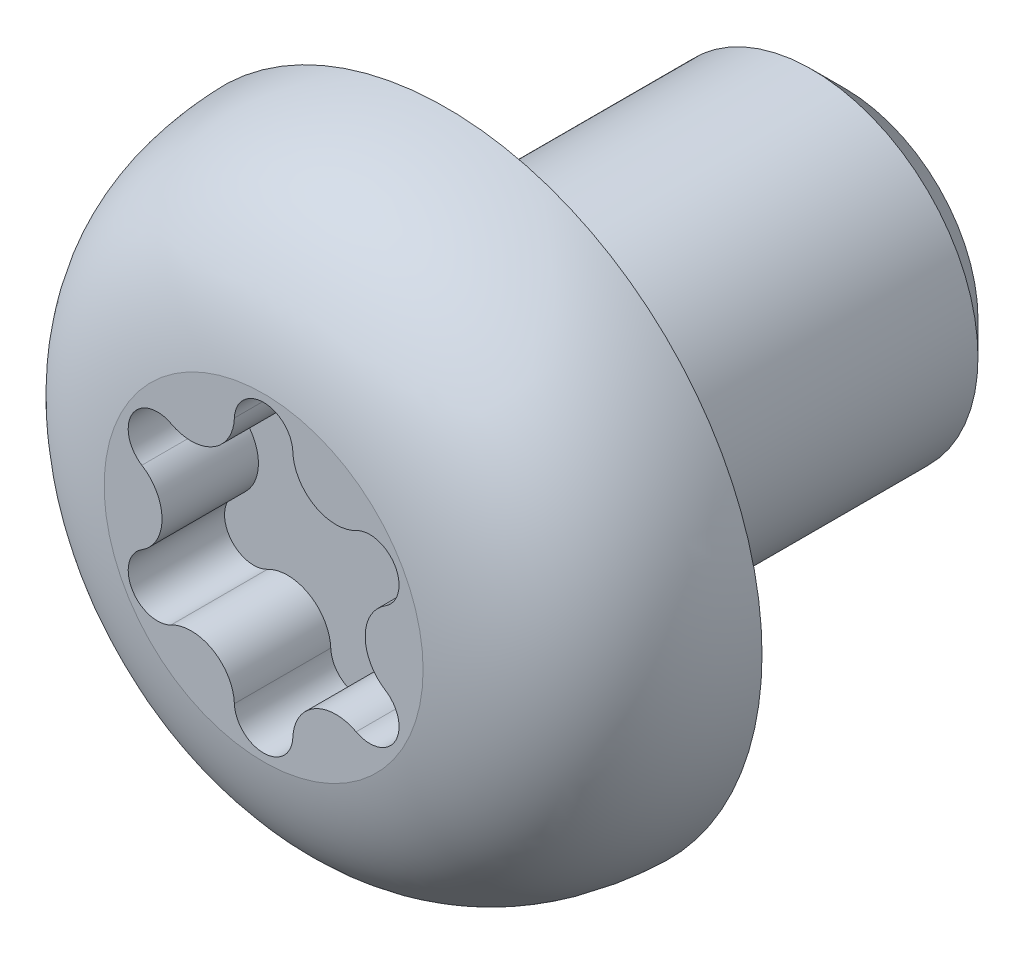
ISO-10303-21;
HEADER;
FILE_DESCRIPTION(('STEP AP214'),'2;1');
FILE_NAME('part.step','',(''),(''),'','','');
FILE_SCHEMA(('AUTOMOTIVE_DESIGN { 1 0 10303 214 1 1 1 1 }'));
ENDSEC;
DATA;
#1=APPLICATION_CONTEXT('core data for automotive mechanical design processes');
#2=APPLICATION_PROTOCOL_DEFINITION('international standard','automotive_design',2000,#1);
#3=PRODUCT_CONTEXT('',#1,'mechanical');
#4=PRODUCT('Part','Part','',(#3));
#5=PRODUCT_RELATED_PRODUCT_CATEGORY('part','',(#4));
#6=PRODUCT_DEFINITION_FORMATION('','',#4);
#7=PRODUCT_DEFINITION_CONTEXT('part definition',#1,'design');
#8=PRODUCT_DEFINITION('design','',#6,#7);
#9=PRODUCT_DEFINITION_SHAPE('','',#8);
#10=(LENGTH_UNIT() NAMED_UNIT(*) SI_UNIT(.MILLI.,.METRE.));
#11=(NAMED_UNIT(*) PLANE_ANGLE_UNIT() SI_UNIT($,.RADIAN.));
#12=(NAMED_UNIT(*) SI_UNIT($,.STERADIAN.) SOLID_ANGLE_UNIT());
#13=UNCERTAINTY_MEASURE_WITH_UNIT(LENGTH_MEASURE(1.E-05),#10,'distance_accuracy_value','');
#14=(GEOMETRIC_REPRESENTATION_CONTEXT(3) GLOBAL_UNCERTAINTY_ASSIGNED_CONTEXT((#13)) GLOBAL_UNIT_ASSIGNED_CONTEXT((#10,
#11,#12)) REPRESENTATION_CONTEXT('',''));
#15=CARTESIAN_POINT('',(0.,0.,0.));
#16=DIRECTION('',(0.,0.,1.));
#17=DIRECTION('',(1.,0.,0.));
#18=AXIS2_PLACEMENT_3D('',#15,#16,#17);
#19=CARTESIAN_POINT('',(0.,0.,1.3));
#20=DIRECTION('',(0.,0.,1.));
#21=DIRECTION('',(1.,0.,0.));
#22=AXIS2_PLACEMENT_3D('',#19,#20,#21);
#23=PLANE('',#22);
#24=CARTESIAN_POINT('',(-1.089207311152,-1.88656240289,1.3));
#25=DIRECTION('',(0.,0.,-1.));
#26=DIRECTION('',(1.,0.,0.));
#27=AXIS2_PLACEMENT_3D('',#24,#25,#26);
#28=CIRCLE('',#27,0.65);
#29=CARTESIAN_POINT('',(-1.392506589353,-1.311662804836,1.3));
#30=VERTEX_POINT('',#29);
#31=CARTESIAN_POINT('',(-0.439680015511,-1.861777483735,1.3));
#32=VERTEX_POINT('',#31);
#33=EDGE_CURVE('E9',#30,#32,#28,.T.);
#34=ORIENTED_EDGE('',*,*,#33,.T.);
#35=CARTESIAN_POINT('',(0.,-1.845,1.3));
#36=DIRECTION('',(0.,0.,1.));
#37=DIRECTION('',(1.,0.,0.));
#38=AXIS2_PLACEMENT_3D('',#35,#36,#37);
#39=CIRCLE('',#38,0.44);
#40=CARTESIAN_POINT('',(0.439680015511,-1.861777483735,1.3));
#41=VERTEX_POINT('',#40);
#42=EDGE_CURVE('E249',#32,#41,#39,.T.);
#43=ORIENTED_EDGE('',*,*,#42,.T.);
#44=CARTESIAN_POINT('',(1.089207311152,-1.88656240289,1.3));
#45=DIRECTION('',(0.,0.,-1.));
#46=DIRECTION('',(1.,0.,0.));
#47=AXIS2_PLACEMENT_3D('',#44,#45,#46);
#48=CIRCLE('',#47,0.65);
#49=CARTESIAN_POINT('',(1.392506589353,-1.311662804836,1.3));
#50=VERTEX_POINT('',#49);
#51=EDGE_CURVE('E278',#41,#50,#48,.T.);
#52=ORIENTED_EDGE('',*,*,#51,.T.);
#53=CARTESIAN_POINT('',(1.597816869982,-0.9225,1.3));
#54=DIRECTION('',(0.,0.,1.));
#55=DIRECTION('',(1.,0.,0.));
#56=AXIS2_PLACEMENT_3D('',#53,#54,#55);
#57=CIRCLE('',#56,0.44);
#58=CARTESIAN_POINT('',(1.832186604864,-0.550114678899,1.3));
#59=VERTEX_POINT('',#58);
#60=EDGE_CURVE('E279',#50,#59,#57,.T.);
#61=ORIENTED_EDGE('',*,*,#60,.T.);
#62=CARTESIAN_POINT('',(2.178414622303,0.,1.3));
#63=DIRECTION('',(0.,0.,-1.));
#64=DIRECTION('',(1.,0.,0.));
#65=AXIS2_PLACEMENT_3D('',#62,#63,#64);
#66=CIRCLE('',#65,0.65);
#67=CARTESIAN_POINT('',(1.832186604864,0.550114678899,1.3));
#68=VERTEX_POINT('',#67);
#69=EDGE_CURVE('E129',#59,#68,#66,.T.);
#70=ORIENTED_EDGE('',*,*,#69,.T.);
#71=CARTESIAN_POINT('',(1.597816869982,0.9225,1.3));
#72=DIRECTION('',(0.,0.,1.));
#73=DIRECTION('',(1.,0.,0.));
#74=AXIS2_PLACEMENT_3D('',#71,#72,#73);
#75=CIRCLE('',#74,0.44);
#76=CARTESIAN_POINT('',(1.392506589353,1.311662804836,1.3));
#77=VERTEX_POINT('',#76);
#78=EDGE_CURVE('E137',#68,#77,#75,.T.);
#79=ORIENTED_EDGE('',*,*,#78,.T.);
#80=CARTESIAN_POINT('',(1.089207311152,1.88656240289,1.3));
#81=DIRECTION('',(0.,0.,-1.));
#82=DIRECTION('',(1.,0.,0.));
#83=AXIS2_PLACEMENT_3D('',#80,#81,#82);
#84=CIRCLE('',#83,0.65);
#85=CARTESIAN_POINT('',(0.439680015511,1.861777483735,1.3));
#86=VERTEX_POINT('',#85);
#87=EDGE_CURVE('E248',#77,#86,#84,.T.);
#88=ORIENTED_EDGE('',*,*,#87,.T.);
#89=CARTESIAN_POINT('',(0.,1.845,1.3));
#90=DIRECTION('',(0.,0.,1.));
#91=DIRECTION('',(1.,0.,0.));
#92=AXIS2_PLACEMENT_3D('',#89,#90,#91);
#93=CIRCLE('',#92,0.44);
#94=CARTESIAN_POINT('',(-0.439680015511,1.861777483735,1.3));
#95=VERTEX_POINT('',#94);
#96=EDGE_CURVE('E241',#86,#95,#93,.T.);
#97=ORIENTED_EDGE('',*,*,#96,.T.);
#98=CARTESIAN_POINT('',(-1.089207311152,1.88656240289,1.3));
#99=DIRECTION('',(0.,0.,-1.));
#100=DIRECTION('',(1.,0.,0.));
#101=AXIS2_PLACEMENT_3D('',#98,#99,#100);
#102=CIRCLE('',#101,0.65);
#103=CARTESIAN_POINT('',(-1.392506589353,1.311662804836,1.3));
#104=VERTEX_POINT('',#103);
#105=EDGE_CURVE('E230',#95,#104,#102,.T.);
#106=ORIENTED_EDGE('',*,*,#105,.T.);
#107=CARTESIAN_POINT('',(-1.597816869982,0.9225,1.3));
#108=DIRECTION('',(0.,0.,1.));
#109=DIRECTION('',(1.,0.,0.));
#110=AXIS2_PLACEMENT_3D('',#107,#108,#109);
#111=CIRCLE('',#110,0.44);
#112=CARTESIAN_POINT('',(-1.832186604864,0.550114678899,1.3));
#113=VERTEX_POINT('',#112);
#114=EDGE_CURVE('E268',#104,#113,#111,.T.);
#115=ORIENTED_EDGE('',*,*,#114,.T.);
#116=CARTESIAN_POINT('',(-2.178414622303,0.,1.3));
#117=DIRECTION('',(0.,0.,-1.));
#118=DIRECTION('',(1.,0.,0.));
#119=AXIS2_PLACEMENT_3D('',#116,#117,#118);
#120=CIRCLE('',#119,0.65);
#121=CARTESIAN_POINT('',(-1.832186604864,-0.550114678899,1.3));
#122=VERTEX_POINT('',#121);
#123=EDGE_CURVE('E197',#113,#122,#120,.T.);
#124=ORIENTED_EDGE('',*,*,#123,.T.);
#125=CARTESIAN_POINT('',(-1.597816869982,-0.9225,1.3));
#126=DIRECTION('',(0.,0.,1.));
#127=DIRECTION('',(1.,0.,0.));
#128=AXIS2_PLACEMENT_3D('',#125,#126,#127);
#129=CIRCLE('',#128,0.44);
#130=EDGE_CURVE('E259',#122,#30,#129,.T.);
#131=ORIENTED_EDGE('',*,*,#130,.T.);
#132=EDGE_LOOP('',(#34,#43,#52,#61,#70,#79,#88,#97,#106,#115,#124,#131));
#133=FACE_BOUND('',#132,.T.);
#134=ADVANCED_FACE('F14',(#133),#23,.T.);
#135=CARTESIAN_POINT('',(-1.089207311152,-1.88656240289,1.3));
#136=DIRECTION('',(0.,0.,-1.));
#137=DIRECTION('',(1.,0.,0.));
#138=AXIS2_PLACEMENT_3D('',#135,#136,#137);
#139=CYLINDRICAL_SURFACE('',#138,0.65);
#140=ORIENTED_EDGE('',*,*,#33,.F.);
#141=DIRECTION('',(0.,0.,1.));
#142=VECTOR('',#141,1.);
#143=CARTESIAN_POINT('',(-1.392506589353,-1.311662804836,1.3));
#144=LINE('',#143,#142);
#145=CARTESIAN_POINT('',(-1.392506589353,-1.311662804836,2.75));
#146=VERTEX_POINT('',#145);
#147=EDGE_CURVE('E194',#30,#146,#144,.T.);
#148=ORIENTED_EDGE('',*,*,#147,.T.);
#149=CARTESIAN_POINT('',(-1.089207311152,-1.88656240289,2.75));
#150=DIRECTION('',(0.,0.,-1.));
#151=DIRECTION('',(1.,0.,0.));
#152=AXIS2_PLACEMENT_3D('',#149,#150,#151);
#153=CIRCLE('',#152,0.65);
#154=CARTESIAN_POINT('',(-0.439680015511,-1.861777483735,2.75));
#155=VERTEX_POINT('',#154);
#156=EDGE_CURVE('E18',#146,#155,#153,.T.);
#157=ORIENTED_EDGE('',*,*,#156,.T.);
#158=DIRECTION('',(0.,0.,1.));
#159=VECTOR('',#158,1.);
#160=CARTESIAN_POINT('',(-0.439680015511,-1.861777483735,1.3));
#161=LINE('',#160,#159);
#162=EDGE_CURVE('E25',#32,#155,#161,.T.);
#163=ORIENTED_EDGE('',*,*,#162,.F.);
#164=EDGE_LOOP('',(#140,#148,#157,#163));
#165=FACE_BOUND('',#164,.T.);
#166=ADVANCED_FACE('F294',(#165),#139,.T.);
#167=CARTESIAN_POINT('',(0.,-1.845,1.3));
#168=DIRECTION('',(0.,0.,-1.));
#169=DIRECTION('',(1.,0.,0.));
#170=AXIS2_PLACEMENT_3D('',#167,#168,#169);
#171=CYLINDRICAL_SURFACE('',#170,0.44);
#172=ORIENTED_EDGE('',*,*,#42,.F.);
#173=ORIENTED_EDGE('',*,*,#162,.T.);
#174=CARTESIAN_POINT('',(0.,-1.845,2.75));
#175=DIRECTION('',(0.,0.,-1.));
#176=DIRECTION('',(1.,0.,0.));
#177=AXIS2_PLACEMENT_3D('',#174,#175,#176);
#178=CIRCLE('',#177,0.44);
#179=CARTESIAN_POINT('',(0.439680015511,-1.861777483735,2.75));
#180=VERTEX_POINT('',#179);
#181=EDGE_CURVE('E226',#180,#155,#178,.T.);
#182=ORIENTED_EDGE('',*,*,#181,.F.);
#183=DIRECTION('',(0.,0.,1.));
#184=VECTOR('',#183,1.);
#185=CARTESIAN_POINT('',(0.439680015511,-1.861777483735,1.3));
#186=LINE('',#185,#184);
#187=EDGE_CURVE('E251',#41,#180,#186,.T.);
#188=ORIENTED_EDGE('',*,*,#187,.F.);
#189=EDGE_LOOP('',(#172,#173,#182,#188));
#190=FACE_BOUND('',#189,.T.);
#191=ADVANCED_FACE('F288',(#190),#171,.F.);
#192=CARTESIAN_POINT('',(1.089207311152,-1.88656240289,1.3));
#193=DIRECTION('',(0.,0.,-1.));
#194=DIRECTION('',(1.,0.,0.));
#195=AXIS2_PLACEMENT_3D('',#192,#193,#194);
#196=CYLINDRICAL_SURFACE('',#195,0.65);
#197=ORIENTED_EDGE('',*,*,#51,.F.);
#198=ORIENTED_EDGE('',*,*,#187,.T.);
#199=CARTESIAN_POINT('',(1.089207311152,-1.88656240289,2.75));
#200=DIRECTION('',(0.,0.,-1.));
#201=DIRECTION('',(1.,0.,0.));
#202=AXIS2_PLACEMENT_3D('',#199,#200,#201);
#203=CIRCLE('',#202,0.65);
#204=CARTESIAN_POINT('',(1.392506589353,-1.311662804836,2.75));
#205=VERTEX_POINT('',#204);
#206=EDGE_CURVE('E218',#180,#205,#203,.T.);
#207=ORIENTED_EDGE('',*,*,#206,.T.);
#208=DIRECTION('',(0.,0.,1.));
#209=VECTOR('',#208,1.);
#210=CARTESIAN_POINT('',(1.392506589353,-1.311662804836,1.3));
#211=LINE('',#210,#209);
#212=EDGE_CURVE('E276',#50,#205,#211,.T.);
#213=ORIENTED_EDGE('',*,*,#212,.F.);
#214=EDGE_LOOP('',(#197,#198,#207,#213));
#215=FACE_BOUND('',#214,.T.);
#216=ADVANCED_FACE('F300',(#215),#196,.T.);
#217=CARTESIAN_POINT('',(1.597816869982,-0.9225,1.3));
#218=DIRECTION('',(0.,0.,-1.));
#219=DIRECTION('',(1.,0.,0.));
#220=AXIS2_PLACEMENT_3D('',#217,#218,#219);
#221=CYLINDRICAL_SURFACE('',#220,0.44);
#222=ORIENTED_EDGE('',*,*,#60,.F.);
#223=ORIENTED_EDGE('',*,*,#212,.T.);
#224=CARTESIAN_POINT('',(1.597816869982,-0.9225,2.75));
#225=DIRECTION('',(0.,0.,-1.));
#226=DIRECTION('',(1.,0.,0.));
#227=AXIS2_PLACEMENT_3D('',#224,#225,#226);
#228=CIRCLE('',#227,0.44);
#229=CARTESIAN_POINT('',(1.832186604864,-0.550114678899,2.75));
#230=VERTEX_POINT('',#229);
#231=EDGE_CURVE('E175',#230,#205,#228,.T.);
#232=ORIENTED_EDGE('',*,*,#231,.F.);
#233=DIRECTION('',(0.,0.,1.));
#234=VECTOR('',#233,1.);
#235=CARTESIAN_POINT('',(1.832186604864,-0.550114678899,1.3));
#236=LINE('',#235,#234);
#237=EDGE_CURVE('E170',#59,#230,#236,.T.);
#238=ORIENTED_EDGE('',*,*,#237,.F.);
#239=EDGE_LOOP('',(#222,#223,#232,#238));
#240=FACE_BOUND('',#239,.T.);
#241=ADVANCED_FACE('F426',(#240),#221,.F.);
#242=CARTESIAN_POINT('',(2.178414622303,0.,1.3));
#243=DIRECTION('',(0.,0.,-1.));
#244=DIRECTION('',(1.,0.,0.));
#245=AXIS2_PLACEMENT_3D('',#242,#243,#244);
#246=CYLINDRICAL_SURFACE('',#245,0.65);
#247=ORIENTED_EDGE('',*,*,#69,.F.);
#248=ORIENTED_EDGE('',*,*,#237,.T.);
#249=CARTESIAN_POINT('',(2.178414622303,0.,2.75));
#250=DIRECTION('',(0.,0.,-1.));
#251=DIRECTION('',(1.,0.,0.));
#252=AXIS2_PLACEMENT_3D('',#249,#250,#251);
#253=CIRCLE('',#252,0.65);
#254=CARTESIAN_POINT('',(1.832186604864,0.550114678899,2.75));
#255=VERTEX_POINT('',#254);
#256=EDGE_CURVE('E167',#230,#255,#253,.T.);
#257=ORIENTED_EDGE('',*,*,#256,.T.);
#258=DIRECTION('',(0.,0.,1.));
#259=VECTOR('',#258,1.);
#260=CARTESIAN_POINT('',(1.832186604864,0.550114678899,1.3));
#261=LINE('',#260,#259);
#262=EDGE_CURVE('E157',#68,#255,#261,.T.);
#263=ORIENTED_EDGE('',*,*,#262,.F.);
#264=EDGE_LOOP('',(#247,#248,#257,#263));
#265=FACE_BOUND('',#264,.T.);
#266=ADVANCED_FACE('F168',(#265),#246,.T.);
#267=CARTESIAN_POINT('',(1.597816869982,0.9225,1.3));
#268=DIRECTION('',(0.,0.,-1.));
#269=DIRECTION('',(1.,0.,0.));
#270=AXIS2_PLACEMENT_3D('',#267,#268,#269);
#271=CYLINDRICAL_SURFACE('',#270,0.44);
#272=ORIENTED_EDGE('',*,*,#78,.F.);
#273=ORIENTED_EDGE('',*,*,#262,.T.);
#274=CARTESIAN_POINT('',(1.597816869982,0.9225,2.75));
#275=DIRECTION('',(0.,0.,-1.));
#276=DIRECTION('',(1.,0.,0.));
#277=AXIS2_PLACEMENT_3D('',#274,#275,#276);
#278=CIRCLE('',#277,0.44);
#279=CARTESIAN_POINT('',(1.392506589353,1.311662804836,2.75));
#280=VERTEX_POINT('',#279);
#281=EDGE_CURVE('E161',#280,#255,#278,.T.);
#282=ORIENTED_EDGE('',*,*,#281,.F.);
#283=DIRECTION('',(0.,0.,1.));
#284=VECTOR('',#283,1.);
#285=CARTESIAN_POINT('',(1.392506589353,1.311662804836,1.3));
#286=LINE('',#285,#284);
#287=EDGE_CURVE('E201',#77,#280,#286,.T.);
#288=ORIENTED_EDGE('',*,*,#287,.F.);
#289=EDGE_LOOP('',(#272,#273,#282,#288));
#290=FACE_BOUND('',#289,.T.);
#291=ADVANCED_FACE('F159',(#290),#271,.F.);
#292=CARTESIAN_POINT('',(1.089207311152,1.88656240289,1.3));
#293=DIRECTION('',(0.,0.,-1.));
#294=DIRECTION('',(1.,0.,0.));
#295=AXIS2_PLACEMENT_3D('',#292,#293,#294);
#296=CYLINDRICAL_SURFACE('',#295,0.65);
#297=ORIENTED_EDGE('',*,*,#87,.F.);
#298=ORIENTED_EDGE('',*,*,#287,.T.);
#299=CARTESIAN_POINT('',(1.089207311152,1.88656240289,2.75));
#300=DIRECTION('',(0.,0.,-1.));
#301=DIRECTION('',(1.,0.,0.));
#302=AXIS2_PLACEMENT_3D('',#299,#300,#301);
#303=CIRCLE('',#302,0.65);
#304=CARTESIAN_POINT('',(0.439680015511,1.861777483735,2.75));
#305=VERTEX_POINT('',#304);
#306=EDGE_CURVE('E182',#280,#305,#303,.T.);
#307=ORIENTED_EDGE('',*,*,#306,.T.);
#308=DIRECTION('',(0.,0.,1.));
#309=VECTOR('',#308,1.);
#310=CARTESIAN_POINT('',(0.439680015511,1.861777483735,1.3));
#311=LINE('',#310,#309);
#312=EDGE_CURVE('E245',#86,#305,#311,.T.);
#313=ORIENTED_EDGE('',*,*,#312,.F.);
#314=EDGE_LOOP('',(#297,#298,#307,#313));
#315=FACE_BOUND('',#314,.T.);
#316=ADVANCED_FACE('F377',(#315),#296,.T.);
#317=CARTESIAN_POINT('',(0.,1.845,1.3));
#318=DIRECTION('',(0.,0.,-1.));
#319=DIRECTION('',(1.,0.,0.));
#320=AXIS2_PLACEMENT_3D('',#317,#318,#319);
#321=CYLINDRICAL_SURFACE('',#320,0.44);
#322=ORIENTED_EDGE('',*,*,#96,.F.);
#323=ORIENTED_EDGE('',*,*,#312,.T.);
#324=CARTESIAN_POINT('',(0.,1.845,2.75));
#325=DIRECTION('',(0.,0.,-1.));
#326=DIRECTION('',(1.,0.,0.));
#327=AXIS2_PLACEMENT_3D('',#324,#325,#326);
#328=CIRCLE('',#327,0.44);
#329=CARTESIAN_POINT('',(-0.439680015511,1.861777483735,2.75));
#330=VERTEX_POINT('',#329);
#331=EDGE_CURVE('E189',#330,#305,#328,.T.);
#332=ORIENTED_EDGE('',*,*,#331,.F.);
#333=DIRECTION('',(0.,0.,1.));
#334=VECTOR('',#333,1.);
#335=CARTESIAN_POINT('',(-0.439680015511,1.861777483735,1.3));
#336=LINE('',#335,#334);
#337=EDGE_CURVE('E233',#95,#330,#336,.T.);
#338=ORIENTED_EDGE('',*,*,#337,.F.);
#339=EDGE_LOOP('',(#322,#323,#332,#338));
#340=FACE_BOUND('',#339,.T.);
#341=ADVANCED_FACE('F379',(#340),#321,.F.);
#342=CARTESIAN_POINT('',(-1.089207311152,1.88656240289,1.3));
#343=DIRECTION('',(0.,0.,-1.));
#344=DIRECTION('',(1.,0.,0.));
#345=AXIS2_PLACEMENT_3D('',#342,#343,#344);
#346=CYLINDRICAL_SURFACE('',#345,0.65);
#347=ORIENTED_EDGE('',*,*,#105,.F.);
#348=ORIENTED_EDGE('',*,*,#337,.T.);
#349=CARTESIAN_POINT('',(-1.089207311152,1.88656240289,2.75));
#350=DIRECTION('',(0.,0.,-1.));
#351=DIRECTION('',(1.,0.,0.));
#352=AXIS2_PLACEMENT_3D('',#349,#350,#351);
#353=CIRCLE('',#352,0.65);
#354=CARTESIAN_POINT('',(-1.392506589353,1.311662804836,2.75));
#355=VERTEX_POINT('',#354);
#356=EDGE_CURVE('E206',#330,#355,#353,.T.);
#357=ORIENTED_EDGE('',*,*,#356,.T.);
#358=DIRECTION('',(0.,0.,1.));
#359=VECTOR('',#358,1.);
#360=CARTESIAN_POINT('',(-1.392506589353,1.311662804836,1.3));
#361=LINE('',#360,#359);
#362=EDGE_CURVE('E234',#104,#355,#361,.T.);
#363=ORIENTED_EDGE('',*,*,#362,.F.);
#364=EDGE_LOOP('',(#347,#348,#357,#363));
#365=FACE_BOUND('',#364,.T.);
#366=ADVANCED_FACE('F372',(#365),#346,.T.);
#367=CARTESIAN_POINT('',(-1.597816869982,0.9225,1.3));
#368=DIRECTION('',(0.,0.,-1.));
#369=DIRECTION('',(1.,0.,0.));
#370=AXIS2_PLACEMENT_3D('',#367,#368,#369);
#371=CYLINDRICAL_SURFACE('',#370,0.44);
#372=ORIENTED_EDGE('',*,*,#114,.F.);
#373=ORIENTED_EDGE('',*,*,#362,.T.);
#374=CARTESIAN_POINT('',(-1.597816869982,0.9225,2.75));
#375=DIRECTION('',(0.,0.,-1.));
#376=DIRECTION('',(1.,0.,0.));
#377=AXIS2_PLACEMENT_3D('',#374,#375,#376);
#378=CIRCLE('',#377,0.44);
#379=CARTESIAN_POINT('',(-1.832186604864,0.550114678899,2.75));
#380=VERTEX_POINT('',#379);
#381=EDGE_CURVE('E202',#380,#355,#378,.T.);
#382=ORIENTED_EDGE('',*,*,#381,.F.);
#383=DIRECTION('',(0.,0.,1.));
#384=VECTOR('',#383,1.);
#385=CARTESIAN_POINT('',(-1.832186604864,0.550114678899,1.3));
#386=LINE('',#385,#384);
#387=EDGE_CURVE('E265',#113,#380,#386,.T.);
#388=ORIENTED_EDGE('',*,*,#387,.F.);
#389=EDGE_LOOP('',(#372,#373,#382,#388));
#390=FACE_BOUND('',#389,.T.);
#391=ADVANCED_FACE('F369',(#390),#371,.F.);
#392=CARTESIAN_POINT('',(-2.178414622303,0.,1.3));
#393=DIRECTION('',(0.,0.,-1.));
#394=DIRECTION('',(1.,0.,0.));
#395=AXIS2_PLACEMENT_3D('',#392,#393,#394);
#396=CYLINDRICAL_SURFACE('',#395,0.65);
#397=ORIENTED_EDGE('',*,*,#123,.F.);
#398=ORIENTED_EDGE('',*,*,#387,.T.);
#399=CARTESIAN_POINT('',(-2.178414622303,0.,2.75));
#400=DIRECTION('',(0.,0.,-1.));
#401=DIRECTION('',(1.,0.,0.));
#402=AXIS2_PLACEMENT_3D('',#399,#400,#401);
#403=CIRCLE('',#402,0.65);
#404=CARTESIAN_POINT('',(-1.832186604864,-0.550114678899,2.75));
#405=VERTEX_POINT('',#404);
#406=EDGE_CURVE('E207',#380,#405,#403,.T.);
#407=ORIENTED_EDGE('',*,*,#406,.T.);
#408=DIRECTION('',(0.,0.,1.));
#409=VECTOR('',#408,1.);
#410=CARTESIAN_POINT('',(-1.832186604864,-0.550114678899,1.3));
#411=LINE('',#410,#409);
#412=EDGE_CURVE('E198',#122,#405,#411,.T.);
#413=ORIENTED_EDGE('',*,*,#412,.F.);
#414=EDGE_LOOP('',(#397,#398,#407,#413));
#415=FACE_BOUND('',#414,.T.);
#416=ADVANCED_FACE('F16',(#415),#396,.T.);
#417=CARTESIAN_POINT('',(-1.597816869982,-0.9225,1.3));
#418=DIRECTION('',(0.,0.,-1.));
#419=DIRECTION('',(1.,0.,0.));
#420=AXIS2_PLACEMENT_3D('',#417,#418,#419);
#421=CYLINDRICAL_SURFACE('',#420,0.44);
#422=ORIENTED_EDGE('',*,*,#130,.F.);
#423=ORIENTED_EDGE('',*,*,#412,.T.);
#424=CARTESIAN_POINT('',(-1.597816869982,-0.9225,2.75));
#425=DIRECTION('',(0.,0.,-1.));
#426=DIRECTION('',(1.,0.,0.));
#427=AXIS2_PLACEMENT_3D('',#424,#425,#426);
#428=CIRCLE('',#427,0.44);
#429=EDGE_CURVE('E255',#146,#405,#428,.T.);
#430=ORIENTED_EDGE('',*,*,#429,.F.);
#431=ORIENTED_EDGE('',*,*,#147,.F.);
#432=EDGE_LOOP('',(#422,#423,#430,#431));
#433=FACE_BOUND('',#432,.T.);
#434=ADVANCED_FACE('F365',(#433),#421,.F.);
#435=CARTESIAN_POINT('',(0.,0.,2.75));
#436=DIRECTION('',(0.,0.,1.));
#437=DIRECTION('',(1.,0.,0.));
#438=AXIS2_PLACEMENT_3D('',#435,#436,#437);
#439=PLANE('',#438);
#440=ORIENTED_EDGE('',*,*,#406,.F.);
#441=ORIENTED_EDGE('',*,*,#381,.T.);
#442=ORIENTED_EDGE('',*,*,#356,.F.);
#443=ORIENTED_EDGE('',*,*,#331,.T.);
#444=ORIENTED_EDGE('',*,*,#306,.F.);
#445=ORIENTED_EDGE('',*,*,#281,.T.);
#446=ORIENTED_EDGE('',*,*,#256,.F.);
#447=ORIENTED_EDGE('',*,*,#231,.T.);
#448=ORIENTED_EDGE('',*,*,#206,.F.);
#449=ORIENTED_EDGE('',*,*,#181,.T.);
#450=ORIENTED_EDGE('',*,*,#156,.F.);
#451=ORIENTED_EDGE('',*,*,#429,.T.);
#452=EDGE_LOOP('',(#440,#441,#442,#443,#444,#445,#446,#447,#448,#449,#450,#451));
#453=FACE_BOUND('',#452,.T.);
#454=CARTESIAN_POINT('',(0.,0.,2.75));
#455=DIRECTION('',(0.,0.,1.));
#456=DIRECTION('',(1.,0.,0.));
#457=AXIS2_PLACEMENT_3D('',#454,#455,#456);
#458=CIRCLE('',#457,2.4);
#459=CARTESIAN_POINT('',(2.4,0.,2.75));
#460=VERTEX_POINT('',#459);
#461=EDGE_CURVE('E212',#460,#460,#458,.T.);
#462=ORIENTED_EDGE('',*,*,#461,.T.);
#463=EDGE_LOOP('',(#462));
#464=FACE_BOUND('',#463,.T.);
#465=ADVANCED_FACE('F178',(#453,#464),#439,.T.);
#466=CARTESIAN_POINT('',(2.4,0.,2.75));
#467=CARTESIAN_POINT('',(3.850094,0.,2.523722));
#468=CARTESIAN_POINT('',(4.693085,0.,1.688395));
#469=CARTESIAN_POINT('',(4.75,0.,0.));
#470=(BOUNDED_CURVE() B_SPLINE_CURVE(3,(#466,#467,#468,#469),.UNSPECIFIED.,.F.,
.F.) B_SPLINE_CURVE_WITH_KNOTS((4,4),(0.,1.),
.UNSPECIFIED.) CURVE() GEOMETRIC_REPRESENTATION_ITEM() RATIONAL_B_SPLINE_CURVE((1.,1.,1.,1.)) REPRESENTATION_ITEM(''));
#471=CARTESIAN_POINT('',(0.,0.,0.));
#472=DIRECTION('',(0.,0.,-1.));
#473=AXIS1_PLACEMENT('',#471,#472);
#474=SURFACE_OF_REVOLUTION('',#470,#473);
#475=CARTESIAN_POINT('',(2.4,0.,2.75));
#476=CARTESIAN_POINT('',(3.850094,0.,2.523722));
#477=CARTESIAN_POINT('',(4.693085,0.,1.688395));
#478=CARTESIAN_POINT('',(4.75,0.,0.));
#479=(BOUNDED_CURVE() B_SPLINE_CURVE(3,(#475,#476,#477,#478),.UNSPECIFIED.,.F.,
.F.) B_SPLINE_CURVE_WITH_KNOTS((4,4),(0.,1.),
.UNSPECIFIED.) CURVE() GEOMETRIC_REPRESENTATION_ITEM() RATIONAL_B_SPLINE_CURVE((1.,1.,1.,1.)) REPRESENTATION_ITEM(''));
#480=CARTESIAN_POINT('',(4.75,0.,0.));
#481=VERTEX_POINT('',#480);
#482=EDGE_CURVE('E78',#460,#481,#479,.T.);
#483=ORIENTED_EDGE('',*,*,#482,.T.);
#484=CARTESIAN_POINT('',(0.,0.,0.));
#485=DIRECTION('',(0.,0.,1.));
#486=DIRECTION('',(1.,0.,0.));
#487=AXIS2_PLACEMENT_3D('',#484,#485,#486);
#488=CIRCLE('',#487,4.75);
#489=EDGE_CURVE('E213',#481,#481,#488,.T.);
#490=ORIENTED_EDGE('',*,*,#489,.T.);
#491=ORIENTED_EDGE('',*,*,#482,.F.);
#492=ORIENTED_EDGE('',*,*,#461,.F.);
#493=EDGE_LOOP('',(#483,#490,#491,#492));
#494=FACE_BOUND('',#493,.T.);
#495=ADVANCED_FACE('F340',(#494),#474,.T.);
#496=CARTESIAN_POINT('',(0.,0.,0.));
#497=DIRECTION('',(0.,0.,1.));
#498=DIRECTION('',(1.,0.,0.));
#499=AXIS2_PLACEMENT_3D('',#496,#497,#498);
#500=PLANE('',#499);
#501=ORIENTED_EDGE('',*,*,#489,.F.);
#502=EDGE_LOOP('',(#501));
#503=FACE_BOUND('',#502,.T.);
#504=CARTESIAN_POINT('',(0.,0.,0.));
#505=DIRECTION('',(0.,0.,1.));
#506=DIRECTION('',(1.,0.,0.));
#507=AXIS2_PLACEMENT_3D('',#504,#505,#506);
#508=CIRCLE('',#507,2.5);
#509=CARTESIAN_POINT('',(2.5,0.,0.));
#510=VERTEX_POINT('',#509);
#511=EDGE_CURVE('E66',#510,#510,#508,.T.);
#512=ORIENTED_EDGE('',*,*,#511,.T.);
#513=EDGE_LOOP('',(#512));
#514=FACE_BOUND('',#513,.T.);
#515=ADVANCED_FACE('F343',(#503,#514),#500,.F.);
#516=CARTESIAN_POINT('',(0.,0.,-5.5));
#517=DIRECTION('',(0.,0.,1.));
#518=DIRECTION('',(1.,0.,0.));
#519=AXIS2_PLACEMENT_3D('',#516,#517,#518);
#520=CYLINDRICAL_SURFACE('',#519,2.5);
#521=CARTESIAN_POINT('',(0.,0.,-5.5));
#522=DIRECTION('',(0.,0.,1.));
#523=DIRECTION('',(1.,0.,0.));
#524=AXIS2_PLACEMENT_3D('',#521,#522,#523);
#525=CIRCLE('',#524,2.5);
#526=CARTESIAN_POINT('',(2.5,0.,-5.5));
#527=VERTEX_POINT('',#526);
#528=EDGE_CURVE('E235',#527,#527,#525,.T.);
#529=ORIENTED_EDGE('',*,*,#528,.T.);
#530=DIRECTION('',(0.,0.,1.));
#531=VECTOR('',#530,1.);
#532=CARTESIAN_POINT('',(2.5,0.,-5.5));
#533=LINE('',#532,#531);
#534=EDGE_CURVE('E239',#527,#510,#533,.T.);
#535=ORIENTED_EDGE('',*,*,#534,.T.);
#536=ORIENTED_EDGE('',*,*,#511,.F.);
#537=ORIENTED_EDGE('',*,*,#534,.F.);
#538=EDGE_LOOP('',(#529,#535,#536,#537));
#539=FACE_BOUND('',#538,.T.);
#540=ADVANCED_FACE('F345',(#539),#520,.T.);
#541=CARTESIAN_POINT('',(0.,0.,-6.));
#542=DIRECTION('',(0.,0.,1.));
#543=DIRECTION('',(1.,0.,0.));
#544=AXIS2_PLACEMENT_3D('',#541,#542,#543);
#545=CONICAL_SURFACE('',#544,2.,0.785398163397);
#546=CARTESIAN_POINT('',(0.,0.,-6.));
#547=DIRECTION('',(0.,0.,1.));
#548=DIRECTION('',(1.,0.,0.));
#549=AXIS2_PLACEMENT_3D('',#546,#547,#548);
#550=CIRCLE('',#549,2.);
#551=CARTESIAN_POINT('',(2.,0.,-6.));
#552=VERTEX_POINT('',#551);
#553=EDGE_CURVE('E311',#552,#552,#550,.T.);
#554=ORIENTED_EDGE('',*,*,#553,.T.);
#555=DIRECTION('',(0.707106781186548,0.,0.707106781186548));
#556=VECTOR('',#555,1.);
#557=CARTESIAN_POINT('',(2.,0.,-6.));
#558=LINE('',#557,#556);
#559=EDGE_CURVE('E240',#552,#527,#558,.T.);
#560=ORIENTED_EDGE('',*,*,#559,.T.);
#561=ORIENTED_EDGE('',*,*,#528,.F.);
#562=ORIENTED_EDGE('',*,*,#559,.F.);
#563=EDGE_LOOP('',(#554,#560,#561,#562));
#564=FACE_BOUND('',#563,.T.);
#565=ADVANCED_FACE('F352',(#564),#545,.T.);
#566=CARTESIAN_POINT('',(0.,0.,-6.));
#567=DIRECTION('',(0.,0.,1.));
#568=DIRECTION('',(1.,0.,0.));
#569=AXIS2_PLACEMENT_3D('',#566,#567,#568);
#570=PLANE('',#569);
#571=ORIENTED_EDGE('',*,*,#553,.F.);
#572=EDGE_LOOP('',(#571));
#573=FACE_BOUND('',#572,.T.);
#574=ADVANCED_FACE('F506',(#573),#570,.F.);
#575=CLOSED_SHELL('',(#134,#166,#191,#216,#241,#266,#291,#316,#341,#366,#391,#416,#434,#465,
#495,#515,#540,#565,#574));
#576=MANIFOLD_SOLID_BREP('B1',#575);
#577=ADVANCED_BREP_SHAPE_REPRESENTATION('',(#18,#576),#14);
#578=SHAPE_DEFINITION_REPRESENTATION(#9,#577);
ENDSEC;
END-ISO-10303-21;
